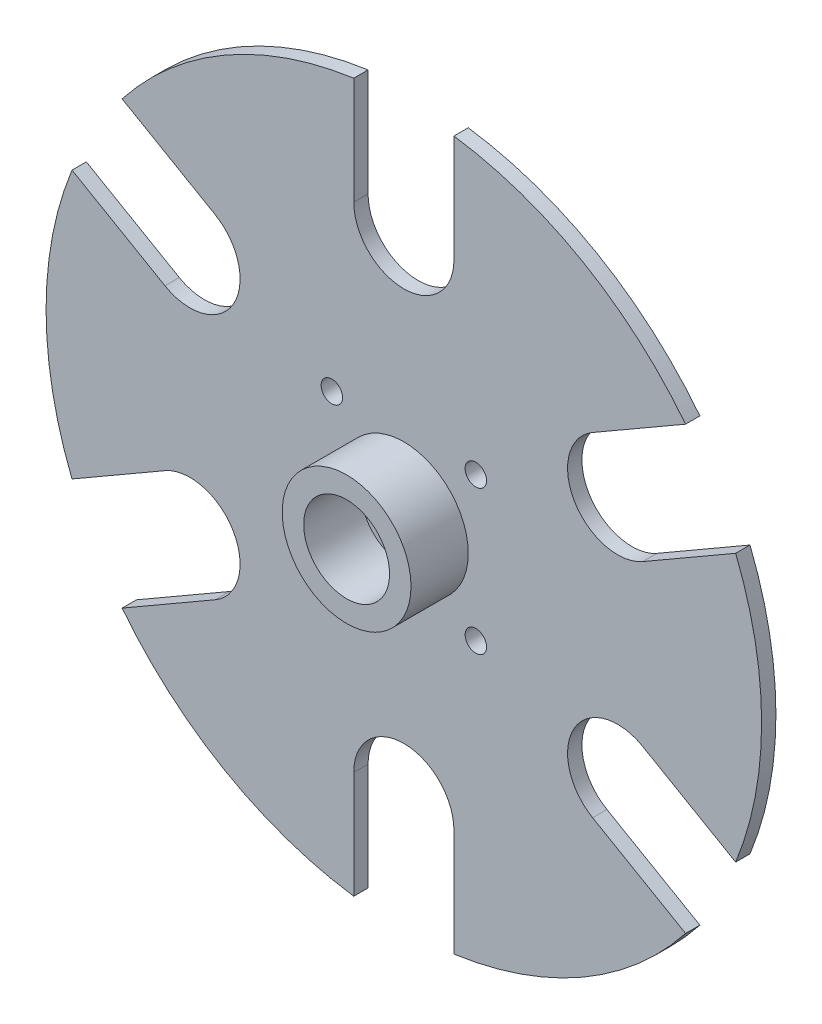
ISO-10303-21;
HEADER;
FILE_DESCRIPTION(('STEP AP214'),'2;1');
FILE_NAME('part.step','',(''),(''),'','','');
FILE_SCHEMA(('AUTOMOTIVE_DESIGN { 1 0 10303 214 1 1 1 1 }'));
ENDSEC;
DATA;
#1=APPLICATION_CONTEXT('core data for automotive mechanical design processes');
#2=APPLICATION_PROTOCOL_DEFINITION('international standard','automotive_design',2000,#1);
#3=PRODUCT_CONTEXT('',#1,'mechanical');
#4=PRODUCT('Part','Part','',(#3));
#5=PRODUCT_RELATED_PRODUCT_CATEGORY('part','',(#4));
#6=PRODUCT_DEFINITION_FORMATION('','',#4);
#7=PRODUCT_DEFINITION_CONTEXT('part definition',#1,'design');
#8=PRODUCT_DEFINITION('design','',#6,#7);
#9=PRODUCT_DEFINITION_SHAPE('','',#8);
#10=(LENGTH_UNIT() NAMED_UNIT(*) SI_UNIT(.MILLI.,.METRE.));
#11=(NAMED_UNIT(*) PLANE_ANGLE_UNIT() SI_UNIT($,.RADIAN.));
#12=(NAMED_UNIT(*) SI_UNIT($,.STERADIAN.) SOLID_ANGLE_UNIT());
#13=UNCERTAINTY_MEASURE_WITH_UNIT(LENGTH_MEASURE(1.E-05),#10,'distance_accuracy_value','');
#14=(GEOMETRIC_REPRESENTATION_CONTEXT(3) GLOBAL_UNCERTAINTY_ASSIGNED_CONTEXT((#13)) GLOBAL_UNIT_ASSIGNED_CONTEXT((#10,
#11,#12)) REPRESENTATION_CONTEXT('',''));
#15=CARTESIAN_POINT('',(0.,0.,0.));
#16=DIRECTION('',(0.,0.,1.));
#17=DIRECTION('',(1.,0.,0.));
#18=AXIS2_PLACEMENT_3D('',#15,#16,#17);
#19=CARTESIAN_POINT('',(0.,0.,7.));
#20=DIRECTION('',(0.,0.,-1.));
#21=DIRECTION('',(-1.,0.,0.));
#22=AXIS2_PLACEMENT_3D('',#19,#20,#21);
#23=CYLINDRICAL_SURFACE('',#22,50.);
#24=CARTESIAN_POINT('',(0.,0.,5.));
#25=DIRECTION('',(0.,0.,1.));
#26=DIRECTION('',(1.,0.,0.));
#27=AXIS2_PLACEMENT_3D('',#24,#25,#26);
#28=CIRCLE('',#27,50.);
#29=CARTESIAN_POINT('',(46.3748177838693,-18.6916097624823,5.));
#30=VERTEX_POINT('',#29);
#31=CARTESIAN_POINT('',(46.3748177838694,18.6916097624819,5.));
#32=VERTEX_POINT('',#31);
#33=EDGE_CURVE('E520',#30,#32,#28,.T.);
#34=ORIENTED_EDGE('',*,*,#33,.T.);
#35=DIRECTION('',(0.,0.,1.));
#36=VECTOR('',#35,1.);
#37=CARTESIAN_POINT('',(46.3748177838694,18.6916097624819,5.));
#38=LINE('',#37,#36);
#39=CARTESIAN_POINT('',(46.3748177838694,18.6916097624819,7.));
#40=VERTEX_POINT('',#39);
#41=EDGE_CURVE('E229',#32,#40,#38,.T.);
#42=ORIENTED_EDGE('',*,*,#41,.T.);
#43=CARTESIAN_POINT('',(0.,0.,7.));
#44=DIRECTION('',(0.,0.,1.));
#45=DIRECTION('',(1.,0.,0.));
#46=AXIS2_PLACEMENT_3D('',#43,#44,#45);
#47=CIRCLE('',#46,50.);
#48=CARTESIAN_POINT('',(46.3748177838693,-18.6916097624823,7.));
#49=VERTEX_POINT('',#48);
#50=EDGE_CURVE('E549',#49,#40,#47,.T.);
#51=ORIENTED_EDGE('',*,*,#50,.F.);
#52=DIRECTION('',(0.,0.,1.));
#53=VECTOR('',#52,1.);
#54=CARTESIAN_POINT('',(46.3748177838693,-18.6916097624823,5.));
#55=LINE('',#54,#53);
#56=EDGE_CURVE('E243',#30,#49,#55,.T.);
#57=ORIENTED_EDGE('',*,*,#56,.F.);
#58=EDGE_LOOP('',(#34,#42,#51,#57));
#59=FACE_BOUND('',#58,.T.);
#60=ADVANCED_FACE('F33',(#59),#23,.T.);
#61=CARTESIAN_POINT('',(6.99999999999966,-49.5075751779463,5.));
#62=VERTEX_POINT('',#61);
#63=CARTESIAN_POINT('',(39.3748177838692,-30.8159654154644,5.));
#64=VERTEX_POINT('',#63);
#65=EDGE_CURVE('E521',#62,#64,#28,.T.);
#66=ORIENTED_EDGE('',*,*,#65,.T.);
#67=DIRECTION('',(0.,0.,1.));
#68=VECTOR('',#67,1.);
#69=CARTESIAN_POINT('',(39.3748177838692,-30.8159654154644,5.));
#70=LINE('',#69,#68);
#71=CARTESIAN_POINT('',(39.3748177838692,-30.8159654154644,7.));
#72=VERTEX_POINT('',#71);
#73=EDGE_CURVE('E227',#64,#72,#70,.T.);
#74=ORIENTED_EDGE('',*,*,#73,.T.);
#75=CARTESIAN_POINT('',(6.99999999999966,-49.5075751779463,7.));
#76=VERTEX_POINT('',#75);
#77=EDGE_CURVE('E545',#76,#72,#47,.T.);
#78=ORIENTED_EDGE('',*,*,#77,.F.);
#79=DIRECTION('',(0.,0.,1.));
#80=VECTOR('',#79,1.);
#81=CARTESIAN_POINT('',(6.99999999999966,-49.5075751779463,5.));
#82=LINE('',#81,#80);
#83=EDGE_CURVE('E269',#62,#76,#82,.T.);
#84=ORIENTED_EDGE('',*,*,#83,.F.);
#85=EDGE_LOOP('',(#66,#74,#78,#84));
#86=FACE_BOUND('',#85,.T.);
#87=ADVANCED_FACE('F477',(#86),#23,.T.);
#88=CARTESIAN_POINT('',(-39.3748177838696,-30.8159654154638,5.));
#89=VERTEX_POINT('',#88);
#90=CARTESIAN_POINT('',(-7.00000000000035,-49.5075751779462,5.));
#91=VERTEX_POINT('',#90);
#92=EDGE_CURVE('E524',#89,#91,#28,.T.);
#93=ORIENTED_EDGE('',*,*,#92,.T.);
#94=DIRECTION('',(0.,0.,1.));
#95=VECTOR('',#94,1.);
#96=CARTESIAN_POINT('',(-7.00000000000035,-49.5075751779462,5.));
#97=LINE('',#96,#95);
#98=CARTESIAN_POINT('',(-7.00000000000035,-49.5075751779462,7.));
#99=VERTEX_POINT('',#98);
#100=EDGE_CURVE('E248',#91,#99,#97,.T.);
#101=ORIENTED_EDGE('',*,*,#100,.T.);
#102=CARTESIAN_POINT('',(-39.3748177838696,-30.8159654154638,7.));
#103=VERTEX_POINT('',#102);
#104=EDGE_CURVE('E543',#103,#99,#47,.T.);
#105=ORIENTED_EDGE('',*,*,#104,.F.);
#106=DIRECTION('',(0.,0.,1.));
#107=VECTOR('',#106,1.);
#108=CARTESIAN_POINT('',(-39.3748177838696,-30.8159654154638,5.));
#109=LINE('',#108,#107);
#110=EDGE_CURVE('E295',#89,#103,#109,.T.);
#111=ORIENTED_EDGE('',*,*,#110,.F.);
#112=EDGE_LOOP('',(#93,#101,#105,#111));
#113=FACE_BOUND('',#112,.T.);
#114=ADVANCED_FACE('F483',(#113),#23,.T.);
#115=CARTESIAN_POINT('',(-46.3748177838691,18.6916097624826,5.));
#116=VERTEX_POINT('',#115);
#117=CARTESIAN_POINT('',(-46.3748177838695,-18.6916097624816,5.));
#118=VERTEX_POINT('',#117);
#119=EDGE_CURVE('E370',#116,#118,#28,.T.);
#120=ORIENTED_EDGE('',*,*,#119,.T.);
#121=DIRECTION('',(0.,0.,1.));
#122=VECTOR('',#121,1.);
#123=CARTESIAN_POINT('',(-46.3748177838695,-18.6916097624816,5.));
#124=LINE('',#123,#122);
#125=CARTESIAN_POINT('',(-46.3748177838695,-18.6916097624816,7.));
#126=VERTEX_POINT('',#125);
#127=EDGE_CURVE('E274',#118,#126,#124,.T.);
#128=ORIENTED_EDGE('',*,*,#127,.T.);
#129=CARTESIAN_POINT('',(-46.3748177838691,18.6916097624826,7.));
#130=VERTEX_POINT('',#129);
#131=EDGE_CURVE('E365',#130,#126,#47,.T.);
#132=ORIENTED_EDGE('',*,*,#131,.F.);
#133=DIRECTION('',(0.,0.,1.));
#134=VECTOR('',#133,1.);
#135=CARTESIAN_POINT('',(-46.3748177838691,18.6916097624826,5.));
#136=LINE('',#135,#134);
#137=EDGE_CURVE('E321',#116,#130,#136,.T.);
#138=ORIENTED_EDGE('',*,*,#137,.F.);
#139=EDGE_LOOP('',(#120,#128,#132,#138));
#140=FACE_BOUND('',#139,.T.);
#141=ADVANCED_FACE('F492',(#140),#23,.T.);
#142=CARTESIAN_POINT('',(-7.,49.5075751779463,5.));
#143=VERTEX_POINT('',#142);
#144=CARTESIAN_POINT('',(-39.374817783869,30.8159654154647,5.));
#145=VERTEX_POINT('',#144);
#146=EDGE_CURVE('E367',#143,#145,#28,.T.);
#147=ORIENTED_EDGE('',*,*,#146,.T.);
#148=DIRECTION('',(0.,0.,1.));
#149=VECTOR('',#148,1.);
#150=CARTESIAN_POINT('',(-39.374817783869,30.8159654154647,5.));
#151=LINE('',#150,#149);
#152=CARTESIAN_POINT('',(-39.374817783869,30.8159654154647,7.));
#153=VERTEX_POINT('',#152);
#154=EDGE_CURVE('E300',#145,#153,#151,.T.);
#155=ORIENTED_EDGE('',*,*,#154,.T.);
#156=CARTESIAN_POINT('',(-7.,49.5075751779463,7.));
#157=VERTEX_POINT('',#156);
#158=EDGE_CURVE('E361',#157,#153,#47,.T.);
#159=ORIENTED_EDGE('',*,*,#158,.F.);
#160=DIRECTION('',(0.,0.,1.));
#161=VECTOR('',#160,1.);
#162=CARTESIAN_POINT('',(-7.,49.5075751779463,5.));
#163=LINE('',#162,#161);
#164=EDGE_CURVE('E345',#143,#157,#163,.T.);
#165=ORIENTED_EDGE('',*,*,#164,.F.);
#166=EDGE_LOOP('',(#147,#155,#159,#165));
#167=FACE_BOUND('',#166,.T.);
#168=ADVANCED_FACE('F474',(#167),#23,.T.);
#169=CARTESIAN_POINT('',(0.,0.,5.));
#170=DIRECTION('',(0.,0.,-1.));
#171=DIRECTION('',(-1.,0.,0.));
#172=AXIS2_PLACEMENT_3D('',#169,#170,#171);
#173=CYLINDRICAL_SURFACE('',#172,6.);
#174=CARTESIAN_POINT('',(0.,0.,0.));
#175=DIRECTION('',(0.,0.,1.));
#176=DIRECTION('',(1.,0.,0.));
#177=AXIS2_PLACEMENT_3D('',#174,#175,#176);
#178=CIRCLE('',#177,6.);
#179=CARTESIAN_POINT('',(6.,0.,0.));
#180=VERTEX_POINT('',#179);
#181=EDGE_CURVE('E391',#180,#180,#178,.T.);
#182=ORIENTED_EDGE('',*,*,#181,.F.);
#183=EDGE_LOOP('',(#182));
#184=FACE_BOUND('',#183,.T.);
#185=CARTESIAN_POINT('',(0.,0.,5.));
#186=DIRECTION('',(0.,0.,1.));
#187=DIRECTION('',(1.,0.,0.));
#188=AXIS2_PLACEMENT_3D('',#185,#186,#187);
#189=CIRCLE('',#188,6.);
#190=CARTESIAN_POINT('',(6.,0.,5.));
#191=VERTEX_POINT('',#190);
#192=EDGE_CURVE('E364',#191,#191,#189,.T.);
#193=ORIENTED_EDGE('',*,*,#192,.T.);
#194=EDGE_LOOP('',(#193));
#195=FACE_BOUND('',#194,.T.);
#196=ADVANCED_FACE('F403',(#184,#195),#173,.F.);
#197=CARTESIAN_POINT('',(0.,0.,0.));
#198=DIRECTION('',(0.,0.,1.));
#199=DIRECTION('',(1.,0.,0.));
#200=AXIS2_PLACEMENT_3D('',#197,#198,#199);
#201=PLANE('',#200);
#202=CARTESIAN_POINT('',(0.,0.,0.));
#203=DIRECTION('',(0.,0.,1.));
#204=DIRECTION('',(1.,0.,0.));
#205=AXIS2_PLACEMENT_3D('',#202,#203,#204);
#206=CIRCLE('',#205,20.);
#207=CARTESIAN_POINT('',(20.,0.,0.));
#208=VERTEX_POINT('',#207);
#209=EDGE_CURVE('E394',#208,#208,#206,.T.);
#210=ORIENTED_EDGE('',*,*,#209,.F.);
#211=EDGE_LOOP('',(#210));
#212=FACE_BOUND('',#211,.T.);
#213=ORIENTED_EDGE('',*,*,#181,.T.);
#214=EDGE_LOOP('',(#213));
#215=FACE_BOUND('',#214,.T.);
#216=CARTESIAN_POINT('',(-10.0619514030223,10.0619514030222,0.));
#217=DIRECTION('',(0.,0.,1.));
#218=DIRECTION('',(1.,0.,0.));
#219=AXIS2_PLACEMENT_3D('',#216,#217,#218);
#220=CIRCLE('',#219,1.5);
#221=CARTESIAN_POINT('',(-8.56195140302228,10.0619514030222,0.));
#222=VERTEX_POINT('',#221);
#223=EDGE_CURVE('E388',#222,#222,#220,.T.);
#224=ORIENTED_EDGE('',*,*,#223,.T.);
#225=EDGE_LOOP('',(#224));
#226=FACE_BOUND('',#225,.T.);
#227=CARTESIAN_POINT('',(10.0619514030223,10.0619514030222,0.));
#228=DIRECTION('',(0.,0.,1.));
#229=DIRECTION('',(-1.,0.,0.));
#230=AXIS2_PLACEMENT_3D('',#227,#228,#229);
#231=CIRCLE('',#230,1.5);
#232=CARTESIAN_POINT('',(8.56195140302228,10.0619514030222,0.));
#233=VERTEX_POINT('',#232);
#234=EDGE_CURVE('E385',#233,#233,#231,.T.);
#235=ORIENTED_EDGE('',*,*,#234,.T.);
#236=EDGE_LOOP('',(#235));
#237=FACE_BOUND('',#236,.T.);
#238=CARTESIAN_POINT('',(10.0619514030223,-10.0619514030222,0.));
#239=DIRECTION('',(0.,0.,1.));
#240=DIRECTION('',(1.,0.,0.));
#241=AXIS2_PLACEMENT_3D('',#238,#239,#240);
#242=CIRCLE('',#241,1.5);
#243=CARTESIAN_POINT('',(11.5619514030223,-10.0619514030222,0.));
#244=VERTEX_POINT('',#243);
#245=EDGE_CURVE('E382',#244,#244,#242,.T.);
#246=ORIENTED_EDGE('',*,*,#245,.T.);
#247=EDGE_LOOP('',(#246));
#248=FACE_BOUND('',#247,.T.);
#249=CARTESIAN_POINT('',(-10.0619514030223,-10.0619514030222,0.));
#250=DIRECTION('',(0.,0.,1.));
#251=DIRECTION('',(-1.,0.,0.));
#252=AXIS2_PLACEMENT_3D('',#249,#250,#251);
#253=CIRCLE('',#252,1.5);
#254=CARTESIAN_POINT('',(-11.5619514030223,-10.0619514030222,0.));
#255=VERTEX_POINT('',#254);
#256=EDGE_CURVE('E379',#255,#255,#253,.T.);
#257=ORIENTED_EDGE('',*,*,#256,.T.);
#258=EDGE_LOOP('',(#257));
#259=FACE_BOUND('',#258,.T.);
#260=ADVANCED_FACE('F400',(#212,#215,#226,#237,#248,#259),#201,.F.);
#261=CARTESIAN_POINT('',(0.,0.,5.));
#262=DIRECTION('',(0.,0.,-1.));
#263=DIRECTION('',(-1.,0.,0.));
#264=AXIS2_PLACEMENT_3D('',#261,#262,#263);
#265=CYLINDRICAL_SURFACE('',#264,20.);
#266=CARTESIAN_POINT('',(0.,0.,5.));
#267=DIRECTION('',(0.,0.,1.));
#268=DIRECTION('',(1.,0.,0.));
#269=AXIS2_PLACEMENT_3D('',#266,#267,#268);
#270=CIRCLE('',#269,20.);
#271=CARTESIAN_POINT('',(20.,0.,5.));
#272=VERTEX_POINT('',#271);
#273=EDGE_CURVE('E42',#272,#272,#270,.T.);
#274=ORIENTED_EDGE('',*,*,#273,.F.);
#275=EDGE_LOOP('',(#274));
#276=FACE_BOUND('',#275,.T.);
#277=ORIENTED_EDGE('',*,*,#209,.T.);
#278=EDGE_LOOP('',(#277));
#279=FACE_BOUND('',#278,.T.);
#280=ADVANCED_FACE('F35',(#276,#279),#265,.T.);
#281=CARTESIAN_POINT('',(-10.0619514030223,10.0619514030222,5.));
#282=DIRECTION('',(0.,0.,-1.));
#283=DIRECTION('',(-1.,0.,0.));
#284=AXIS2_PLACEMENT_3D('',#281,#282,#283);
#285=CYLINDRICAL_SURFACE('',#284,1.5);
#286=ORIENTED_EDGE('',*,*,#223,.F.);
#287=EDGE_LOOP('',(#286));
#288=FACE_BOUND('',#287,.T.);
#289=CARTESIAN_POINT('',(-10.0619514030223,10.0619514030222,7.));
#290=DIRECTION('',(0.,0.,1.));
#291=DIRECTION('',(1.,0.,0.));
#292=AXIS2_PLACEMENT_3D('',#289,#290,#291);
#293=CIRCLE('',#292,1.5);
#294=CARTESIAN_POINT('',(-8.56195140302228,10.0619514030222,7.));
#295=VERTEX_POINT('',#294);
#296=EDGE_CURVE('E426',#295,#295,#293,.T.);
#297=ORIENTED_EDGE('',*,*,#296,.T.);
#298=EDGE_LOOP('',(#297));
#299=FACE_BOUND('',#298,.T.);
#300=ADVANCED_FACE('F432',(#288,#299),#285,.F.);
#301=CARTESIAN_POINT('',(10.0619514030223,10.0619514030222,5.));
#302=DIRECTION('',(0.,0.,-1.));
#303=DIRECTION('',(-1.,0.,0.));
#304=AXIS2_PLACEMENT_3D('',#301,#302,#303);
#305=CYLINDRICAL_SURFACE('',#304,1.5);
#306=ORIENTED_EDGE('',*,*,#234,.F.);
#307=EDGE_LOOP('',(#306));
#308=FACE_BOUND('',#307,.T.);
#309=CARTESIAN_POINT('',(10.0619514030223,10.0619514030222,7.));
#310=DIRECTION('',(0.,0.,1.));
#311=DIRECTION('',(1.,0.,0.));
#312=AXIS2_PLACEMENT_3D('',#309,#310,#311);
#313=CIRCLE('',#312,1.5);
#314=CARTESIAN_POINT('',(11.5619514030223,10.0619514030222,7.));
#315=VERTEX_POINT('',#314);
#316=EDGE_CURVE('E222',#315,#315,#313,.T.);
#317=ORIENTED_EDGE('',*,*,#316,.T.);
#318=EDGE_LOOP('',(#317));
#319=FACE_BOUND('',#318,.T.);
#320=ADVANCED_FACE('F766',(#308,#319),#305,.F.);
#321=CARTESIAN_POINT('',(10.0619514030223,-10.0619514030222,5.));
#322=DIRECTION('',(0.,0.,-1.));
#323=DIRECTION('',(-1.,0.,0.));
#324=AXIS2_PLACEMENT_3D('',#321,#322,#323);
#325=CYLINDRICAL_SURFACE('',#324,1.5);
#326=ORIENTED_EDGE('',*,*,#245,.F.);
#327=EDGE_LOOP('',(#326));
#328=FACE_BOUND('',#327,.T.);
#329=CARTESIAN_POINT('',(10.0619514030223,-10.0619514030222,7.));
#330=DIRECTION('',(0.,0.,1.));
#331=DIRECTION('',(1.,0.,0.));
#332=AXIS2_PLACEMENT_3D('',#329,#330,#331);
#333=CIRCLE('',#332,1.5);
#334=CARTESIAN_POINT('',(11.5619514030223,-10.0619514030222,7.));
#335=VERTEX_POINT('',#334);
#336=EDGE_CURVE('E423',#335,#335,#333,.T.);
#337=ORIENTED_EDGE('',*,*,#336,.T.);
#338=EDGE_LOOP('',(#337));
#339=FACE_BOUND('',#338,.T.);
#340=ADVANCED_FACE('F417',(#328,#339),#325,.F.);
#341=CARTESIAN_POINT('',(-10.0619514030223,-10.0619514030222,5.));
#342=DIRECTION('',(0.,0.,-1.));
#343=DIRECTION('',(-1.,0.,0.));
#344=AXIS2_PLACEMENT_3D('',#341,#342,#343);
#345=CYLINDRICAL_SURFACE('',#344,1.5);
#346=ORIENTED_EDGE('',*,*,#256,.F.);
#347=EDGE_LOOP('',(#346));
#348=FACE_BOUND('',#347,.T.);
#349=CARTESIAN_POINT('',(-10.0619514030223,-10.0619514030222,7.));
#350=DIRECTION('',(0.,0.,1.));
#351=DIRECTION('',(1.,0.,0.));
#352=AXIS2_PLACEMENT_3D('',#349,#350,#351);
#353=CIRCLE('',#352,1.5);
#354=CARTESIAN_POINT('',(-8.56195140302228,-10.0619514030222,7.));
#355=VERTEX_POINT('',#354);
#356=EDGE_CURVE('E421',#355,#355,#353,.T.);
#357=ORIENTED_EDGE('',*,*,#356,.T.);
#358=EDGE_LOOP('',(#357));
#359=FACE_BOUND('',#358,.T.);
#360=ADVANCED_FACE('F414',(#348,#359),#345,.F.);
#361=CARTESIAN_POINT('',(0.,0.,5.));
#362=DIRECTION('',(0.,0.,1.));
#363=DIRECTION('',(1.,0.,0.));
#364=AXIS2_PLACEMENT_3D('',#361,#362,#363);
#365=PLANE('',#364);
#366=ORIENTED_EDGE('',*,*,#273,.T.);
#367=EDGE_LOOP('',(#366));
#368=FACE_BOUND('',#367,.T.);
#369=CARTESIAN_POINT('',(29.8844367271028,17.2537875889731,5.));
#370=DIRECTION('',(0.,0.,1.));
#371=DIRECTION('',(1.,0.,0.));
#372=AXIS2_PLACEMENT_3D('',#369,#370,#371);
#373=CIRCLE('',#372,7.);
#374=CARTESIAN_POINT('',(26.3844367271028,23.3159654154642,5.));
#375=VERTEX_POINT('',#374);
#376=CARTESIAN_POINT('',(33.3844367271028,11.1916097624821,5.));
#377=VERTEX_POINT('',#376);
#378=EDGE_CURVE('E206',#375,#377,#373,.T.);
#379=ORIENTED_EDGE('',*,*,#378,.T.);
#380=DIRECTION('',(0.866025403784443,0.499999999999993,0.));
#381=VECTOR('',#380,1.);
#382=CARTESIAN_POINT('',(46.3748177838694,18.6916097624819,5.));
#383=LINE('',#382,#381);
#384=EDGE_CURVE('E211',#377,#32,#383,.T.);
#385=ORIENTED_EDGE('',*,*,#384,.T.);
#386=ORIENTED_EDGE('',*,*,#33,.F.);
#387=DIRECTION('',(-0.866025403784431,0.500000000000013,0.));
#388=VECTOR('',#387,1.);
#389=CARTESIAN_POINT('',(46.3748177838693,-18.6916097624823,5.));
#390=LINE('',#389,#388);
#391=CARTESIAN_POINT('',(33.3844367271028,-11.1916097624821,5.));
#392=VERTEX_POINT('',#391);
#393=EDGE_CURVE('E58',#30,#392,#390,.T.);
#394=ORIENTED_EDGE('',*,*,#393,.T.);
#395=CARTESIAN_POINT('',(29.8844367271028,-17.2537875889731,5.));
#396=DIRECTION('',(0.,0.,1.));
#397=DIRECTION('',(1.,0.,0.));
#398=AXIS2_PLACEMENT_3D('',#395,#396,#397);
#399=CIRCLE('',#398,7.);
#400=CARTESIAN_POINT('',(26.3844367271028,-23.3159654154642,5.));
#401=VERTEX_POINT('',#400);
#402=EDGE_CURVE('E236',#392,#401,#399,.T.);
#403=ORIENTED_EDGE('',*,*,#402,.T.);
#404=DIRECTION('',(0.866025403784431,-0.500000000000014,0.));
#405=VECTOR('',#404,1.);
#406=CARTESIAN_POINT('',(39.3748177838692,-30.8159654154644,5.));
#407=LINE('',#406,#405);
#408=EDGE_CURVE('E240',#401,#64,#407,.T.);
#409=ORIENTED_EDGE('',*,*,#408,.T.);
#410=ORIENTED_EDGE('',*,*,#65,.F.);
#411=DIRECTION('',(0.,1.,0.));
#412=VECTOR('',#411,1.);
#413=CARTESIAN_POINT('',(6.99999999999966,-49.5075751779463,5.));
#414=LINE('',#413,#412);
#415=CARTESIAN_POINT('',(7.,-34.5075751779463,5.));
#416=VERTEX_POINT('',#415);
#417=EDGE_CURVE('E259',#62,#416,#414,.T.);
#418=ORIENTED_EDGE('',*,*,#417,.T.);
#419=CARTESIAN_POINT('',(0.,-34.5075751779463,5.));
#420=DIRECTION('',(0.,0.,1.));
#421=DIRECTION('',(1.,0.,0.));
#422=AXIS2_PLACEMENT_3D('',#419,#420,#421);
#423=CIRCLE('',#422,7.);
#424=CARTESIAN_POINT('',(-6.99999999999999,-34.5075751779463,5.));
#425=VERTEX_POINT('',#424);
#426=EDGE_CURVE('E262',#416,#425,#423,.T.);
#427=ORIENTED_EDGE('',*,*,#426,.T.);
#428=DIRECTION('',(0.,-1.,0.));
#429=VECTOR('',#428,1.);
#430=CARTESIAN_POINT('',(-7.00000000000035,-49.5075751779462,5.));
#431=LINE('',#430,#429);
#432=EDGE_CURVE('E266',#425,#91,#431,.T.);
#433=ORIENTED_EDGE('',*,*,#432,.T.);
#434=ORIENTED_EDGE('',*,*,#92,.F.);
#435=DIRECTION('',(0.866025403784455,0.499999999999972,0.));
#436=VECTOR('',#435,1.);
#437=CARTESIAN_POINT('',(-39.3748177838696,-30.8159654154638,5.));
#438=LINE('',#437,#436);
#439=CARTESIAN_POINT('',(-26.3844367271028,-23.3159654154642,5.));
#440=VERTEX_POINT('',#439);
#441=EDGE_CURVE('E285',#89,#440,#438,.T.);
#442=ORIENTED_EDGE('',*,*,#441,.T.);
#443=CARTESIAN_POINT('',(-29.8844367271028,-17.2537875889732,5.));
#444=DIRECTION('',(0.,0.,1.));
#445=DIRECTION('',(1.,0.,0.));
#446=AXIS2_PLACEMENT_3D('',#443,#444,#445);
#447=CIRCLE('',#446,7.);
#448=CARTESIAN_POINT('',(-33.3844367271028,-11.1916097624821,5.));
#449=VERTEX_POINT('',#448);
#450=EDGE_CURVE('E288',#440,#449,#447,.T.);
#451=ORIENTED_EDGE('',*,*,#450,.T.);
#452=DIRECTION('',(-0.866025403784455,-0.499999999999972,0.));
#453=VECTOR('',#452,1.);
#454=CARTESIAN_POINT('',(-46.3748177838695,-18.6916097624816,5.));
#455=LINE('',#454,#453);
#456=EDGE_CURVE('E292',#449,#118,#455,.T.);
#457=ORIENTED_EDGE('',*,*,#456,.T.);
#458=ORIENTED_EDGE('',*,*,#119,.F.);
#459=DIRECTION('',(0.866025403784419,-0.500000000000035,0.));
#460=VECTOR('',#459,1.);
#461=CARTESIAN_POINT('',(-46.3748177838691,18.6916097624826,5.));
#462=LINE('',#461,#460);
#463=CARTESIAN_POINT('',(-33.3844367271028,11.191609762482,5.));
#464=VERTEX_POINT('',#463);
#465=EDGE_CURVE('E311',#116,#464,#462,.T.);
#466=ORIENTED_EDGE('',*,*,#465,.T.);
#467=CARTESIAN_POINT('',(-29.8844367271028,17.2537875889731,5.));
#468=DIRECTION('',(0.,0.,1.));
#469=DIRECTION('',(1.,0.,0.));
#470=AXIS2_PLACEMENT_3D('',#467,#468,#469);
#471=CIRCLE('',#470,7.);
#472=CARTESIAN_POINT('',(-26.3844367271028,23.3159654154642,5.));
#473=VERTEX_POINT('',#472);
#474=EDGE_CURVE('E314',#464,#473,#471,.T.);
#475=ORIENTED_EDGE('',*,*,#474,.T.);
#476=DIRECTION('',(-0.866025403784419,0.500000000000035,0.));
#477=VECTOR('',#476,1.);
#478=CARTESIAN_POINT('',(-39.374817783869,30.8159654154647,5.));
#479=LINE('',#478,#477);
#480=EDGE_CURVE('E318',#473,#145,#479,.T.);
#481=ORIENTED_EDGE('',*,*,#480,.T.);
#482=ORIENTED_EDGE('',*,*,#146,.F.);
#483=DIRECTION('',(0.,-1.,0.));
#484=VECTOR('',#483,1.);
#485=CARTESIAN_POINT('',(-7.,49.5075751779463,5.));
#486=LINE('',#485,#484);
#487=CARTESIAN_POINT('',(-7.,34.5075751779463,5.));
#488=VERTEX_POINT('',#487);
#489=EDGE_CURVE('E336',#143,#488,#486,.T.);
#490=ORIENTED_EDGE('',*,*,#489,.T.);
#491=CARTESIAN_POINT('',(0.,34.5075751779463,5.));
#492=DIRECTION('',(0.,0.,1.));
#493=DIRECTION('',(1.,0.,0.));
#494=AXIS2_PLACEMENT_3D('',#491,#492,#493);
#495=CIRCLE('',#494,7.);
#496=CARTESIAN_POINT('',(6.99999999999999,34.5075751779463,5.));
#497=VERTEX_POINT('',#496);
#498=EDGE_CURVE('E339',#488,#497,#495,.T.);
#499=ORIENTED_EDGE('',*,*,#498,.T.);
#500=DIRECTION('',(0.,1.,0.));
#501=VECTOR('',#500,1.);
#502=CARTESIAN_POINT('',(7.,49.5075751779463,5.));
#503=LINE('',#502,#501);
#504=CARTESIAN_POINT('',(7.,49.5075751779463,5.));
#505=VERTEX_POINT('',#504);
#506=EDGE_CURVE('E343',#497,#505,#503,.T.);
#507=ORIENTED_EDGE('',*,*,#506,.T.);
#508=CARTESIAN_POINT('',(39.3748177838694,30.8159654154641,5.));
#509=VERTEX_POINT('',#508);
#510=EDGE_CURVE('E216',#509,#505,#28,.T.);
#511=ORIENTED_EDGE('',*,*,#510,.F.);
#512=DIRECTION('',(-0.866025403784443,-0.499999999999993,0.));
#513=VECTOR('',#512,1.);
#514=CARTESIAN_POINT('',(39.3748177838694,30.8159654154641,5.));
#515=LINE('',#514,#513);
#516=EDGE_CURVE('E50',#509,#375,#515,.T.);
#517=ORIENTED_EDGE('',*,*,#516,.T.);
#518=EDGE_LOOP('',(#379,#385,#386,#394,#403,#409,#410,#418,#427,#433,#434,#442,#451,#457,#458,
#466,#475,#481,#482,#490,#499,#507,#511,#517));
#519=FACE_BOUND('',#518,.T.);
#520=ADVANCED_FACE('F214',(#368,#519),#365,.F.);
#521=CARTESIAN_POINT('',(0.,0.,7.));
#522=DIRECTION('',(0.,0.,1.));
#523=DIRECTION('',(1.,0.,0.));
#524=AXIS2_PLACEMENT_3D('',#521,#522,#523);
#525=PLANE('',#524);
#526=ORIENTED_EDGE('',*,*,#336,.F.);
#527=EDGE_LOOP('',(#526));
#528=FACE_BOUND('',#527,.T.);
#529=ORIENTED_EDGE('',*,*,#296,.F.);
#530=EDGE_LOOP('',(#529));
#531=FACE_BOUND('',#530,.T.);
#532=ORIENTED_EDGE('',*,*,#356,.F.);
#533=EDGE_LOOP('',(#532));
#534=FACE_BOUND('',#533,.T.);
#535=ORIENTED_EDGE('',*,*,#316,.F.);
#536=EDGE_LOOP('',(#535));
#537=FACE_BOUND('',#536,.T.);
#538=DIRECTION('',(0.866025403784443,0.499999999999993,0.));
#539=VECTOR('',#538,1.);
#540=CARTESIAN_POINT('',(46.3748177838694,18.6916097624819,7.));
#541=LINE('',#540,#539);
#542=CARTESIAN_POINT('',(33.3844367271028,11.1916097624821,7.));
#543=VERTEX_POINT('',#542);
#544=EDGE_CURVE('E217',#543,#40,#541,.T.);
#545=ORIENTED_EDGE('',*,*,#544,.F.);
#546=CARTESIAN_POINT('',(29.8844367271028,17.2537875889731,7.));
#547=DIRECTION('',(0.,0.,1.));
#548=DIRECTION('',(1.,0.,0.));
#549=AXIS2_PLACEMENT_3D('',#546,#547,#548);
#550=CIRCLE('',#549,7.);
#551=CARTESIAN_POINT('',(26.3844367271028,23.3159654154642,7.));
#552=VERTEX_POINT('',#551);
#553=EDGE_CURVE('E219',#552,#543,#550,.T.);
#554=ORIENTED_EDGE('',*,*,#553,.F.);
#555=DIRECTION('',(-0.866025403784443,-0.499999999999993,0.));
#556=VECTOR('',#555,1.);
#557=CARTESIAN_POINT('',(39.3748177838694,30.8159654154641,7.));
#558=LINE('',#557,#556);
#559=CARTESIAN_POINT('',(39.3748177838694,30.8159654154641,7.));
#560=VERTEX_POINT('',#559);
#561=EDGE_CURVE('E198',#560,#552,#558,.T.);
#562=ORIENTED_EDGE('',*,*,#561,.F.);
#563=CARTESIAN_POINT('',(7.,49.5075751779463,7.));
#564=VERTEX_POINT('',#563);
#565=EDGE_CURVE('E366',#560,#564,#47,.T.);
#566=ORIENTED_EDGE('',*,*,#565,.T.);
#567=DIRECTION('',(0.,1.,0.));
#568=VECTOR('',#567,1.);
#569=CARTESIAN_POINT('',(7.,49.5075751779463,7.));
#570=LINE('',#569,#568);
#571=CARTESIAN_POINT('',(6.99999999999999,34.5075751779463,7.));
#572=VERTEX_POINT('',#571);
#573=EDGE_CURVE('E340',#572,#564,#570,.T.);
#574=ORIENTED_EDGE('',*,*,#573,.F.);
#575=CARTESIAN_POINT('',(0.,34.5075751779463,7.));
#576=DIRECTION('',(0.,0.,1.));
#577=DIRECTION('',(1.,0.,0.));
#578=AXIS2_PLACEMENT_3D('',#575,#576,#577);
#579=CIRCLE('',#578,7.);
#580=CARTESIAN_POINT('',(-7.,34.5075751779463,7.));
#581=VERTEX_POINT('',#580);
#582=EDGE_CURVE('E348',#581,#572,#579,.T.);
#583=ORIENTED_EDGE('',*,*,#582,.F.);
#584=DIRECTION('',(0.,-1.,0.));
#585=VECTOR('',#584,1.);
#586=CARTESIAN_POINT('',(-7.,49.5075751779463,7.));
#587=LINE('',#586,#585);
#588=EDGE_CURVE('E232',#157,#581,#587,.T.);
#589=ORIENTED_EDGE('',*,*,#588,.F.);
#590=ORIENTED_EDGE('',*,*,#158,.T.);
#591=DIRECTION('',(-0.866025403784419,0.500000000000035,0.));
#592=VECTOR('',#591,1.);
#593=CARTESIAN_POINT('',(-39.374817783869,30.8159654154647,7.));
#594=LINE('',#593,#592);
#595=CARTESIAN_POINT('',(-26.3844367271028,23.3159654154642,7.));
#596=VERTEX_POINT('',#595);
#597=EDGE_CURVE('E315',#596,#153,#594,.T.);
#598=ORIENTED_EDGE('',*,*,#597,.F.);
#599=CARTESIAN_POINT('',(-29.8844367271028,17.2537875889731,7.));
#600=DIRECTION('',(0.,0.,1.));
#601=DIRECTION('',(1.,0.,0.));
#602=AXIS2_PLACEMENT_3D('',#599,#600,#601);
#603=CIRCLE('',#602,7.);
#604=CARTESIAN_POINT('',(-33.3844367271028,11.191609762482,7.));
#605=VERTEX_POINT('',#604);
#606=EDGE_CURVE('E325',#605,#596,#603,.T.);
#607=ORIENTED_EDGE('',*,*,#606,.F.);
#608=DIRECTION('',(0.866025403784419,-0.500000000000035,0.));
#609=VECTOR('',#608,1.);
#610=CARTESIAN_POINT('',(-46.3748177838691,18.6916097624826,7.));
#611=LINE('',#610,#609);
#612=EDGE_CURVE('E322',#130,#605,#611,.T.);
#613=ORIENTED_EDGE('',*,*,#612,.F.);
#614=ORIENTED_EDGE('',*,*,#131,.T.);
#615=DIRECTION('',(-0.866025403784455,-0.499999999999972,0.));
#616=VECTOR('',#615,1.);
#617=CARTESIAN_POINT('',(-46.3748177838695,-18.6916097624816,7.));
#618=LINE('',#617,#616);
#619=CARTESIAN_POINT('',(-33.3844367271028,-11.1916097624821,7.));
#620=VERTEX_POINT('',#619);
#621=EDGE_CURVE('E289',#620,#126,#618,.T.);
#622=ORIENTED_EDGE('',*,*,#621,.F.);
#623=CARTESIAN_POINT('',(-29.8844367271028,-17.2537875889732,7.));
#624=DIRECTION('',(0.,0.,1.));
#625=DIRECTION('',(1.,0.,0.));
#626=AXIS2_PLACEMENT_3D('',#623,#624,#625);
#627=CIRCLE('',#626,7.);
#628=CARTESIAN_POINT('',(-26.3844367271028,-23.3159654154642,7.));
#629=VERTEX_POINT('',#628);
#630=EDGE_CURVE('E299',#629,#620,#627,.T.);
#631=ORIENTED_EDGE('',*,*,#630,.F.);
#632=DIRECTION('',(0.866025403784455,0.499999999999972,0.));
#633=VECTOR('',#632,1.);
#634=CARTESIAN_POINT('',(-39.3748177838696,-30.8159654154638,7.));
#635=LINE('',#634,#633);
#636=EDGE_CURVE('E296',#103,#629,#635,.T.);
#637=ORIENTED_EDGE('',*,*,#636,.F.);
#638=ORIENTED_EDGE('',*,*,#104,.T.);
#639=DIRECTION('',(0.,-1.,0.));
#640=VECTOR('',#639,1.);
#641=CARTESIAN_POINT('',(-7.00000000000035,-49.5075751779462,7.));
#642=LINE('',#641,#640);
#643=CARTESIAN_POINT('',(-6.99999999999999,-34.5075751779463,7.));
#644=VERTEX_POINT('',#643);
#645=EDGE_CURVE('E263',#644,#99,#642,.T.);
#646=ORIENTED_EDGE('',*,*,#645,.F.);
#647=CARTESIAN_POINT('',(0.,-34.5075751779463,7.));
#648=DIRECTION('',(0.,0.,1.));
#649=DIRECTION('',(1.,0.,0.));
#650=AXIS2_PLACEMENT_3D('',#647,#648,#649);
#651=CIRCLE('',#650,7.);
#652=CARTESIAN_POINT('',(7.,-34.5075751779463,7.));
#653=VERTEX_POINT('',#652);
#654=EDGE_CURVE('E273',#653,#644,#651,.T.);
#655=ORIENTED_EDGE('',*,*,#654,.F.);
#656=DIRECTION('',(0.,1.,0.));
#657=VECTOR('',#656,1.);
#658=CARTESIAN_POINT('',(6.99999999999966,-49.5075751779463,7.));
#659=LINE('',#658,#657);
#660=EDGE_CURVE('E270',#76,#653,#659,.T.);
#661=ORIENTED_EDGE('',*,*,#660,.F.);
#662=ORIENTED_EDGE('',*,*,#77,.T.);
#663=DIRECTION('',(0.866025403784431,-0.500000000000014,0.));
#664=VECTOR('',#663,1.);
#665=CARTESIAN_POINT('',(39.3748177838692,-30.8159654154644,7.));
#666=LINE('',#665,#664);
#667=CARTESIAN_POINT('',(26.3844367271028,-23.3159654154642,7.));
#668=VERTEX_POINT('',#667);
#669=EDGE_CURVE('E237',#668,#72,#666,.T.);
#670=ORIENTED_EDGE('',*,*,#669,.F.);
#671=CARTESIAN_POINT('',(29.8844367271028,-17.2537875889731,7.));
#672=DIRECTION('',(0.,0.,1.));
#673=DIRECTION('',(1.,0.,0.));
#674=AXIS2_PLACEMENT_3D('',#671,#672,#673);
#675=CIRCLE('',#674,7.);
#676=CARTESIAN_POINT('',(33.3844367271028,-11.1916097624821,7.));
#677=VERTEX_POINT('',#676);
#678=EDGE_CURVE('E247',#677,#668,#675,.T.);
#679=ORIENTED_EDGE('',*,*,#678,.F.);
#680=DIRECTION('',(-0.866025403784431,0.500000000000013,0.));
#681=VECTOR('',#680,1.);
#682=CARTESIAN_POINT('',(46.3748177838693,-18.6916097624823,7.));
#683=LINE('',#682,#681);
#684=EDGE_CURVE('E244',#49,#677,#683,.T.);
#685=ORIENTED_EDGE('',*,*,#684,.F.);
#686=ORIENTED_EDGE('',*,*,#50,.T.);
#687=EDGE_LOOP('',(#545,#554,#562,#566,#574,#583,#589,#590,#598,#607,#613,#614,#622,#631,#637,
#638,#646,#655,#661,#662,#670,#679,#685,#686));
#688=FACE_BOUND('',#687,.T.);
#689=CARTESIAN_POINT('',(0.,0.,7.));
#690=DIRECTION('',(0.,0.,1.));
#691=DIRECTION('',(1.,0.,0.));
#692=AXIS2_PLACEMENT_3D('',#689,#690,#691);
#693=CIRCLE('',#692,9.);
#694=CARTESIAN_POINT('',(9.,0.,7.));
#695=VERTEX_POINT('',#694);
#696=EDGE_CURVE('E37',#695,#695,#693,.T.);
#697=ORIENTED_EDGE('',*,*,#696,.F.);
#698=EDGE_LOOP('',(#697));
#699=FACE_BOUND('',#698,.T.);
#700=ADVANCED_FACE('F434',(#528,#531,#534,#537,#688,#699),#525,.T.);
#701=ORIENTED_EDGE('',*,*,#565,.F.);
#702=DIRECTION('',(0.,0.,1.));
#703=VECTOR('',#702,1.);
#704=CARTESIAN_POINT('',(39.3748177838694,30.8159654154641,5.));
#705=LINE('',#704,#703);
#706=EDGE_CURVE('E203',#509,#560,#705,.T.);
#707=ORIENTED_EDGE('',*,*,#706,.F.);
#708=ORIENTED_EDGE('',*,*,#510,.T.);
#709=DIRECTION('',(0.,0.,1.));
#710=VECTOR('',#709,1.);
#711=CARTESIAN_POINT('',(7.,49.5075751779463,5.));
#712=LINE('',#711,#710);
#713=EDGE_CURVE('E353',#505,#564,#712,.T.);
#714=ORIENTED_EDGE('',*,*,#713,.T.);
#715=EDGE_LOOP('',(#701,#707,#708,#714));
#716=FACE_BOUND('',#715,.T.);
#717=ADVANCED_FACE('F436',(#716),#23,.T.);
#718=ORIENTED_EDGE('',*,*,#192,.F.);
#719=EDGE_LOOP('',(#718));
#720=FACE_BOUND('',#719,.T.);
#721=ADVANCED_FACE('F463',(#720),#365,.F.);
#722=CARTESIAN_POINT('',(0.,0.,7.));
#723=DIRECTION('',(0.,0.,1.));
#724=DIRECTION('',(1.,0.,0.));
#725=AXIS2_PLACEMENT_3D('',#722,#723,#724);
#726=CIRCLE('',#725,6.);
#727=CARTESIAN_POINT('',(6.,0.,7.));
#728=VERTEX_POINT('',#727);
#729=EDGE_CURVE('E11',#728,#728,#726,.T.);
#730=ORIENTED_EDGE('',*,*,#729,.F.);
#731=EDGE_LOOP('',(#730));
#732=FACE_BOUND('',#731,.T.);
#733=CARTESIAN_POINT('',(0.,0.,15.));
#734=DIRECTION('',(0.,0.,1.));
#735=DIRECTION('',(1.,0.,0.));
#736=AXIS2_PLACEMENT_3D('',#733,#734,#735);
#737=CIRCLE('',#736,6.);
#738=CARTESIAN_POINT('',(6.,0.,15.));
#739=VERTEX_POINT('',#738);
#740=EDGE_CURVE('E373',#739,#739,#737,.T.);
#741=ORIENTED_EDGE('',*,*,#740,.T.);
#742=EDGE_LOOP('',(#741));
#743=FACE_BOUND('',#742,.T.);
#744=ADVANCED_FACE('F458',(#732,#743),#173,.F.);
#745=CARTESIAN_POINT('',(0.,0.,15.));
#746=DIRECTION('',(0.,0.,1.));
#747=DIRECTION('',(1.,0.,0.));
#748=AXIS2_PLACEMENT_3D('',#745,#746,#747);
#749=PLANE('',#748);
#750=CARTESIAN_POINT('',(0.,0.,15.));
#751=DIRECTION('',(0.,0.,1.));
#752=DIRECTION('',(1.,0.,0.));
#753=AXIS2_PLACEMENT_3D('',#750,#751,#752);
#754=CIRCLE('',#753,9.);
#755=CARTESIAN_POINT('',(9.,0.,15.));
#756=VERTEX_POINT('',#755);
#757=EDGE_CURVE('E376',#756,#756,#754,.T.);
#758=ORIENTED_EDGE('',*,*,#757,.T.);
#759=EDGE_LOOP('',(#758));
#760=FACE_BOUND('',#759,.T.);
#761=ORIENTED_EDGE('',*,*,#740,.F.);
#762=EDGE_LOOP('',(#761));
#763=FACE_BOUND('',#762,.T.);
#764=ADVANCED_FACE('F452',(#760,#763),#749,.T.);
#765=CARTESIAN_POINT('',(0.,0.,15.));
#766=DIRECTION('',(0.,0.,-1.));
#767=DIRECTION('',(-1.,0.,0.));
#768=AXIS2_PLACEMENT_3D('',#765,#766,#767);
#769=CYLINDRICAL_SURFACE('',#768,9.);
#770=ORIENTED_EDGE('',*,*,#696,.T.);
#771=EDGE_LOOP('',(#770));
#772=FACE_BOUND('',#771,.T.);
#773=ORIENTED_EDGE('',*,*,#757,.F.);
#774=EDGE_LOOP('',(#773));
#775=FACE_BOUND('',#774,.T.);
#776=ADVANCED_FACE('F449',(#772,#775),#769,.T.);
#777=ORIENTED_EDGE('',*,*,#729,.T.);
#778=EDGE_LOOP('',(#777));
#779=FACE_BOUND('',#778,.T.);
#780=ADVANCED_FACE('F439',(#779),#525,.T.);
#781=CARTESIAN_POINT('',(7.,49.5075751779463,5.));
#782=DIRECTION('',(1.,0.,0.));
#783=DIRECTION('',(0.,1.,0.));
#784=AXIS2_PLACEMENT_3D('',#781,#782,#783);
#785=PLANE('',#784);
#786=ORIENTED_EDGE('',*,*,#573,.T.);
#787=ORIENTED_EDGE('',*,*,#713,.F.);
#788=ORIENTED_EDGE('',*,*,#506,.F.);
#789=DIRECTION('',(0.,0.,1.));
#790=VECTOR('',#789,1.);
#791=CARTESIAN_POINT('',(6.99999999999999,34.5075751779463,5.));
#792=LINE('',#791,#790);
#793=EDGE_CURVE('E356',#497,#572,#792,.T.);
#794=ORIENTED_EDGE('',*,*,#793,.T.);
#795=EDGE_LOOP('',(#786,#787,#788,#794));
#796=FACE_BOUND('',#795,.T.);
#797=ADVANCED_FACE('F519',(#796),#785,.F.);
#798=CARTESIAN_POINT('',(0.,34.5075751779463,5.));
#799=DIRECTION('',(0.,0.,1.));
#800=DIRECTION('',(1.,0.,0.));
#801=AXIS2_PLACEMENT_3D('',#798,#799,#800);
#802=CYLINDRICAL_SURFACE('',#801,7.);
#803=ORIENTED_EDGE('',*,*,#582,.T.);
#804=ORIENTED_EDGE('',*,*,#793,.F.);
#805=ORIENTED_EDGE('',*,*,#498,.F.);
#806=DIRECTION('',(0.,0.,1.));
#807=VECTOR('',#806,1.);
#808=CARTESIAN_POINT('',(-7.,34.5075751779463,5.));
#809=LINE('',#808,#807);
#810=EDGE_CURVE('E358',#488,#581,#809,.T.);
#811=ORIENTED_EDGE('',*,*,#810,.T.);
#812=EDGE_LOOP('',(#803,#804,#805,#811));
#813=FACE_BOUND('',#812,.T.);
#814=ADVANCED_FACE('F515',(#813),#802,.F.);
#815=CARTESIAN_POINT('',(-7.,49.5075751779463,5.));
#816=DIRECTION('',(-1.,0.,0.));
#817=DIRECTION('',(0.,-1.,0.));
#818=AXIS2_PLACEMENT_3D('',#815,#816,#817);
#819=PLANE('',#818);
#820=ORIENTED_EDGE('',*,*,#588,.T.);
#821=ORIENTED_EDGE('',*,*,#810,.F.);
#822=ORIENTED_EDGE('',*,*,#489,.F.);
#823=ORIENTED_EDGE('',*,*,#164,.T.);
#824=EDGE_LOOP('',(#820,#821,#822,#823));
#825=FACE_BOUND('',#824,.T.);
#826=ADVANCED_FACE('F512',(#825),#819,.F.);
#827=CARTESIAN_POINT('',(-39.374817783869,30.8159654154647,5.));
#828=DIRECTION('',(0.500000000000035,0.866025403784419,0.));
#829=DIRECTION('',(-0.866025403784419,0.500000000000035,0.));
#830=AXIS2_PLACEMENT_3D('',#827,#828,#829);
#831=PLANE('',#830);
#832=ORIENTED_EDGE('',*,*,#597,.T.);
#833=ORIENTED_EDGE('',*,*,#154,.F.);
#834=ORIENTED_EDGE('',*,*,#480,.F.);
#835=DIRECTION('',(0.,0.,1.));
#836=VECTOR('',#835,1.);
#837=CARTESIAN_POINT('',(-26.3844367271028,23.3159654154642,5.));
#838=LINE('',#837,#836);
#839=EDGE_CURVE('E331',#473,#596,#838,.T.);
#840=ORIENTED_EDGE('',*,*,#839,.T.);
#841=EDGE_LOOP('',(#832,#833,#834,#840));
#842=FACE_BOUND('',#841,.T.);
#843=ADVANCED_FACE('F504',(#842),#831,.F.);
#844=CARTESIAN_POINT('',(-29.8844367271028,17.2537875889731,5.));
#845=DIRECTION('',(0.,0.,1.));
#846=DIRECTION('',(1.,0.,0.));
#847=AXIS2_PLACEMENT_3D('',#844,#845,#846);
#848=CYLINDRICAL_SURFACE('',#847,7.);
#849=ORIENTED_EDGE('',*,*,#606,.T.);
#850=ORIENTED_EDGE('',*,*,#839,.F.);
#851=ORIENTED_EDGE('',*,*,#474,.F.);
#852=DIRECTION('',(0.,0.,1.));
#853=VECTOR('',#852,1.);
#854=CARTESIAN_POINT('',(-33.3844367271028,11.191609762482,5.));
#855=LINE('',#854,#853);
#856=EDGE_CURVE('E333',#464,#605,#855,.T.);
#857=ORIENTED_EDGE('',*,*,#856,.T.);
#858=EDGE_LOOP('',(#849,#850,#851,#857));
#859=FACE_BOUND('',#858,.T.);
#860=ADVANCED_FACE('F639',(#859),#848,.F.);
#861=CARTESIAN_POINT('',(-46.3748177838691,18.6916097624826,5.));
#862=DIRECTION('',(-0.500000000000035,-0.866025403784419,0.));
#863=DIRECTION('',(0.866025403784419,-0.500000000000035,0.));
#864=AXIS2_PLACEMENT_3D('',#861,#862,#863);
#865=PLANE('',#864);
#866=ORIENTED_EDGE('',*,*,#612,.T.);
#867=ORIENTED_EDGE('',*,*,#856,.F.);
#868=ORIENTED_EDGE('',*,*,#465,.F.);
#869=ORIENTED_EDGE('',*,*,#137,.T.);
#870=EDGE_LOOP('',(#866,#867,#868,#869));
#871=FACE_BOUND('',#870,.T.);
#872=ADVANCED_FACE('F648',(#871),#865,.F.);
#873=CARTESIAN_POINT('',(-46.3748177838695,-18.6916097624816,5.));
#874=DIRECTION('',(-0.499999999999972,0.866025403784455,0.));
#875=DIRECTION('',(-0.866025403784455,-0.499999999999972,0.));
#876=AXIS2_PLACEMENT_3D('',#873,#874,#875);
#877=PLANE('',#876);
#878=ORIENTED_EDGE('',*,*,#621,.T.);
#879=ORIENTED_EDGE('',*,*,#127,.F.);
#880=ORIENTED_EDGE('',*,*,#456,.F.);
#881=DIRECTION('',(0.,0.,1.));
#882=VECTOR('',#881,1.);
#883=CARTESIAN_POINT('',(-33.3844367271028,-11.1916097624821,5.));
#884=LINE('',#883,#882);
#885=EDGE_CURVE('E306',#449,#620,#884,.T.);
#886=ORIENTED_EDGE('',*,*,#885,.T.);
#887=EDGE_LOOP('',(#878,#879,#880,#886));
#888=FACE_BOUND('',#887,.T.);
#889=ADVANCED_FACE('F539',(#888),#877,.F.);
#890=CARTESIAN_POINT('',(-29.8844367271028,-17.2537875889732,5.));
#891=DIRECTION('',(0.,0.,1.));
#892=DIRECTION('',(1.,0.,0.));
#893=AXIS2_PLACEMENT_3D('',#890,#891,#892);
#894=CYLINDRICAL_SURFACE('',#893,7.);
#895=ORIENTED_EDGE('',*,*,#630,.T.);
#896=ORIENTED_EDGE('',*,*,#885,.F.);
#897=ORIENTED_EDGE('',*,*,#450,.F.);
#898=DIRECTION('',(0.,0.,1.));
#899=VECTOR('',#898,1.);
#900=CARTESIAN_POINT('',(-26.3844367271028,-23.3159654154642,5.));
#901=LINE('',#900,#899);
#902=EDGE_CURVE('E308',#440,#629,#901,.T.);
#903=ORIENTED_EDGE('',*,*,#902,.T.);
#904=EDGE_LOOP('',(#895,#896,#897,#903));
#905=FACE_BOUND('',#904,.T.);
#906=ADVANCED_FACE('F667',(#905),#894,.F.);
#907=CARTESIAN_POINT('',(-39.3748177838696,-30.8159654154638,5.));
#908=DIRECTION('',(0.499999999999972,-0.866025403784455,0.));
#909=DIRECTION('',(0.866025403784455,0.499999999999972,0.));
#910=AXIS2_PLACEMENT_3D('',#907,#908,#909);
#911=PLANE('',#910);
#912=ORIENTED_EDGE('',*,*,#636,.T.);
#913=ORIENTED_EDGE('',*,*,#902,.F.);
#914=ORIENTED_EDGE('',*,*,#441,.F.);
#915=ORIENTED_EDGE('',*,*,#110,.T.);
#916=EDGE_LOOP('',(#912,#913,#914,#915));
#917=FACE_BOUND('',#916,.T.);
#918=ADVANCED_FACE('F574',(#917),#911,.F.);
#919=CARTESIAN_POINT('',(-7.00000000000035,-49.5075751779462,5.));
#920=DIRECTION('',(-1.,0.,0.));
#921=DIRECTION('',(0.,-1.,0.));
#922=AXIS2_PLACEMENT_3D('',#919,#920,#921);
#923=PLANE('',#922);
#924=ORIENTED_EDGE('',*,*,#645,.T.);
#925=ORIENTED_EDGE('',*,*,#100,.F.);
#926=ORIENTED_EDGE('',*,*,#432,.F.);
#927=DIRECTION('',(0.,0.,1.));
#928=VECTOR('',#927,1.);
#929=CARTESIAN_POINT('',(-6.99999999999999,-34.5075751779463,5.));
#930=LINE('',#929,#928);
#931=EDGE_CURVE('E280',#425,#644,#930,.T.);
#932=ORIENTED_EDGE('',*,*,#931,.T.);
#933=EDGE_LOOP('',(#924,#925,#926,#932));
#934=FACE_BOUND('',#933,.T.);
#935=ADVANCED_FACE('F572',(#934),#923,.F.);
#936=CARTESIAN_POINT('',(0.,-34.5075751779463,5.));
#937=DIRECTION('',(0.,0.,1.));
#938=DIRECTION('',(1.,0.,0.));
#939=AXIS2_PLACEMENT_3D('',#936,#937,#938);
#940=CYLINDRICAL_SURFACE('',#939,7.);
#941=ORIENTED_EDGE('',*,*,#654,.T.);
#942=ORIENTED_EDGE('',*,*,#931,.F.);
#943=ORIENTED_EDGE('',*,*,#426,.F.);
#944=DIRECTION('',(0.,0.,1.));
#945=VECTOR('',#944,1.);
#946=CARTESIAN_POINT('',(7.,-34.5075751779463,5.));
#947=LINE('',#946,#945);
#948=EDGE_CURVE('E282',#416,#653,#947,.T.);
#949=ORIENTED_EDGE('',*,*,#948,.T.);
#950=EDGE_LOOP('',(#941,#942,#943,#949));
#951=FACE_BOUND('',#950,.T.);
#952=ADVANCED_FACE('F569',(#951),#940,.F.);
#953=CARTESIAN_POINT('',(6.99999999999966,-49.5075751779463,5.));
#954=DIRECTION('',(1.,0.,0.));
#955=DIRECTION('',(0.,1.,0.));
#956=AXIS2_PLACEMENT_3D('',#953,#954,#955);
#957=PLANE('',#956);
#958=ORIENTED_EDGE('',*,*,#660,.T.);
#959=ORIENTED_EDGE('',*,*,#948,.F.);
#960=ORIENTED_EDGE('',*,*,#417,.F.);
#961=ORIENTED_EDGE('',*,*,#83,.T.);
#962=EDGE_LOOP('',(#958,#959,#960,#961));
#963=FACE_BOUND('',#962,.T.);
#964=ADVANCED_FACE('F566',(#963),#957,.F.);
#965=CARTESIAN_POINT('',(39.3748177838692,-30.8159654154644,5.));
#966=DIRECTION('',(-0.500000000000014,-0.866025403784431,0.));
#967=DIRECTION('',(0.866025403784431,-0.500000000000014,0.));
#968=AXIS2_PLACEMENT_3D('',#965,#966,#967);
#969=PLANE('',#968);
#970=ORIENTED_EDGE('',*,*,#669,.T.);
#971=ORIENTED_EDGE('',*,*,#73,.F.);
#972=ORIENTED_EDGE('',*,*,#408,.F.);
#973=DIRECTION('',(0.,0.,1.));
#974=VECTOR('',#973,1.);
#975=CARTESIAN_POINT('',(26.3844367271028,-23.3159654154642,5.));
#976=LINE('',#975,#974);
#977=EDGE_CURVE('E254',#401,#668,#976,.T.);
#978=ORIENTED_EDGE('',*,*,#977,.T.);
#979=EDGE_LOOP('',(#970,#971,#972,#978));
#980=FACE_BOUND('',#979,.T.);
#981=ADVANCED_FACE('F563',(#980),#969,.F.);
#982=CARTESIAN_POINT('',(29.8844367271028,-17.2537875889731,5.));
#983=DIRECTION('',(0.,0.,1.));
#984=DIRECTION('',(1.,0.,0.));
#985=AXIS2_PLACEMENT_3D('',#982,#983,#984);
#986=CYLINDRICAL_SURFACE('',#985,7.);
#987=ORIENTED_EDGE('',*,*,#678,.T.);
#988=ORIENTED_EDGE('',*,*,#977,.F.);
#989=ORIENTED_EDGE('',*,*,#402,.F.);
#990=DIRECTION('',(0.,0.,1.));
#991=VECTOR('',#990,1.);
#992=CARTESIAN_POINT('',(33.3844367271028,-11.1916097624821,5.));
#993=LINE('',#992,#991);
#994=EDGE_CURVE('E256',#392,#677,#993,.T.);
#995=ORIENTED_EDGE('',*,*,#994,.T.);
#996=EDGE_LOOP('',(#987,#988,#989,#995));
#997=FACE_BOUND('',#996,.T.);
#998=ADVANCED_FACE('F561',(#997),#986,.F.);
#999=CARTESIAN_POINT('',(46.3748177838693,-18.6916097624823,5.));
#1000=DIRECTION('',(0.500000000000013,0.866025403784431,0.));
#1001=DIRECTION('',(-0.866025403784431,0.500000000000013,0.));
#1002=AXIS2_PLACEMENT_3D('',#999,#1000,#1001);
#1003=PLANE('',#1002);
#1004=ORIENTED_EDGE('',*,*,#684,.T.);
#1005=ORIENTED_EDGE('',*,*,#994,.F.);
#1006=ORIENTED_EDGE('',*,*,#393,.F.);
#1007=ORIENTED_EDGE('',*,*,#56,.T.);
#1008=EDGE_LOOP('',(#1004,#1005,#1006,#1007));
#1009=FACE_BOUND('',#1008,.T.);
#1010=ADVANCED_FACE('F725',(#1009),#1003,.F.);
#1011=CARTESIAN_POINT('',(46.3748177838694,18.6916097624819,5.));
#1012=DIRECTION('',(0.499999999999993,-0.866025403784443,0.));
#1013=DIRECTION('',(0.866025403784443,0.499999999999993,0.));
#1014=AXIS2_PLACEMENT_3D('',#1011,#1012,#1013);
#1015=PLANE('',#1014);
#1016=ORIENTED_EDGE('',*,*,#544,.T.);
#1017=ORIENTED_EDGE('',*,*,#41,.F.);
#1018=ORIENTED_EDGE('',*,*,#384,.F.);
#1019=DIRECTION('',(0.,0.,1.));
#1020=VECTOR('',#1019,1.);
#1021=CARTESIAN_POINT('',(33.3844367271028,11.1916097624821,5.));
#1022=LINE('',#1021,#1020);
#1023=EDGE_CURVE('E202',#377,#543,#1022,.T.);
#1024=ORIENTED_EDGE('',*,*,#1023,.T.);
#1025=EDGE_LOOP('',(#1016,#1017,#1018,#1024));
#1026=FACE_BOUND('',#1025,.T.);
#1027=ADVANCED_FACE('F557',(#1026),#1015,.F.);
#1028=CARTESIAN_POINT('',(29.8844367271028,17.2537875889731,5.));
#1029=DIRECTION('',(0.,0.,1.));
#1030=DIRECTION('',(1.,0.,0.));
#1031=AXIS2_PLACEMENT_3D('',#1028,#1029,#1030);
#1032=CYLINDRICAL_SURFACE('',#1031,7.);
#1033=ORIENTED_EDGE('',*,*,#553,.T.);
#1034=ORIENTED_EDGE('',*,*,#1023,.F.);
#1035=ORIENTED_EDGE('',*,*,#378,.F.);
#1036=DIRECTION('',(0.,0.,1.));
#1037=VECTOR('',#1036,1.);
#1038=CARTESIAN_POINT('',(26.3844367271028,23.3159654154642,5.));
#1039=LINE('',#1038,#1037);
#1040=EDGE_CURVE('E194',#375,#552,#1039,.T.);
#1041=ORIENTED_EDGE('',*,*,#1040,.T.);
#1042=EDGE_LOOP('',(#1033,#1034,#1035,#1041));
#1043=FACE_BOUND('',#1042,.T.);
#1044=ADVANCED_FACE('F207',(#1043),#1032,.F.);
#1045=CARTESIAN_POINT('',(39.3748177838694,30.8159654154641,5.));
#1046=DIRECTION('',(-0.499999999999993,0.866025403784443,0.));
#1047=DIRECTION('',(-0.866025403784443,-0.499999999999993,0.));
#1048=AXIS2_PLACEMENT_3D('',#1045,#1046,#1047);
#1049=PLANE('',#1048);
#1050=ORIENTED_EDGE('',*,*,#561,.T.);
#1051=ORIENTED_EDGE('',*,*,#1040,.F.);
#1052=ORIENTED_EDGE('',*,*,#516,.F.);
#1053=ORIENTED_EDGE('',*,*,#706,.T.);
#1054=EDGE_LOOP('',(#1050,#1051,#1052,#1053));
#1055=FACE_BOUND('',#1054,.T.);
#1056=ADVANCED_FACE('F196',(#1055),#1049,.F.);
#1057=CLOSED_SHELL('',(#60,#87,#114,#141,#168,#196,#260,#280,#300,#320,#340,#360,#520,#700,#717,
#721,#744,#764,#776,#780,#797,#814,#826,#843,#860,#872,#889,#906,#918,#935,#952,#964,#981,#998,
#1010,#1027,#1044,#1056));
#1058=MANIFOLD_SOLID_BREP('B2',#1057);
#1059=ADVANCED_BREP_SHAPE_REPRESENTATION('',(#18,#1058),#14);
#1060=SHAPE_DEFINITION_REPRESENTATION(#9,#1059);
ENDSEC;
END-ISO-10303-21;
